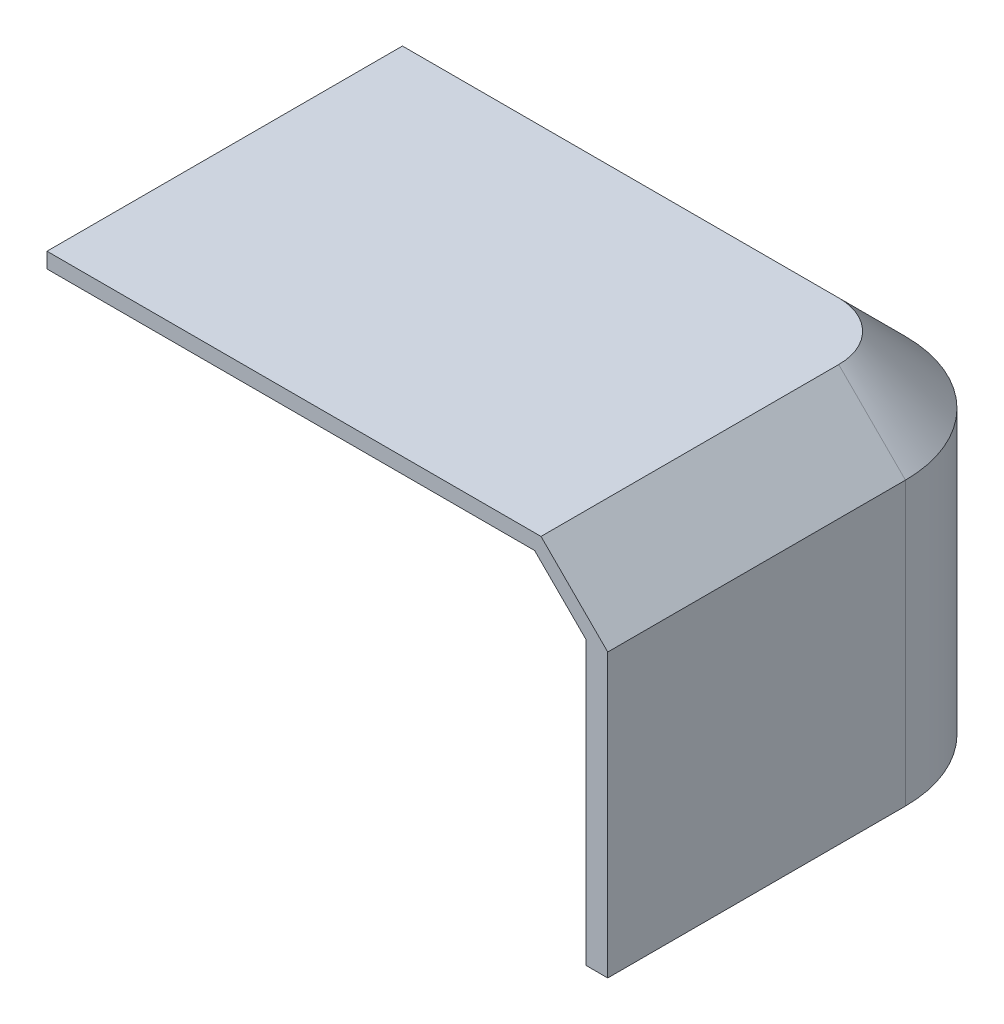
ISO-10303-21;
HEADER;
FILE_DESCRIPTION(('STEP AP214'),'2;1');
FILE_NAME('part.step','',(''),(''),'','','');
FILE_SCHEMA(('AUTOMOTIVE_DESIGN { 1 0 10303 214 1 1 1 1 }'));
ENDSEC;
DATA;
#1=APPLICATION_CONTEXT('core data for automotive mechanical design processes');
#2=APPLICATION_PROTOCOL_DEFINITION('international standard','automotive_design',2000,#1);
#3=PRODUCT_CONTEXT('',#1,'mechanical');
#4=PRODUCT('Part','Part','',(#3));
#5=PRODUCT_RELATED_PRODUCT_CATEGORY('part','',(#4));
#6=PRODUCT_DEFINITION_FORMATION('','',#4);
#7=PRODUCT_DEFINITION_CONTEXT('part definition',#1,'design');
#8=PRODUCT_DEFINITION('design','',#6,#7);
#9=PRODUCT_DEFINITION_SHAPE('','',#8);
#10=(LENGTH_UNIT() NAMED_UNIT(*) SI_UNIT(.MILLI.,.METRE.));
#11=(NAMED_UNIT(*) PLANE_ANGLE_UNIT() SI_UNIT($,.RADIAN.));
#12=(NAMED_UNIT(*) SI_UNIT($,.STERADIAN.) SOLID_ANGLE_UNIT());
#13=UNCERTAINTY_MEASURE_WITH_UNIT(LENGTH_MEASURE(1.E-05),#10,'distance_accuracy_value','');
#14=(GEOMETRIC_REPRESENTATION_CONTEXT(3) GLOBAL_UNCERTAINTY_ASSIGNED_CONTEXT((#13)) GLOBAL_UNIT_ASSIGNED_CONTEXT((#10,
#11,#12)) REPRESENTATION_CONTEXT('',''));
#15=CARTESIAN_POINT('',(0.,0.,0.));
#16=DIRECTION('',(0.,0.,1.));
#17=DIRECTION('',(1.,0.,0.));
#18=AXIS2_PLACEMENT_3D('',#15,#16,#17);
#19=CARTESIAN_POINT('',(0.,-10.,0.));
#20=DIRECTION('',(-1.,0.,0.));
#21=DIRECTION('',(0.,0.,1.));
#22=AXIS2_PLACEMENT_3D('',#19,#20,#21);
#23=PLANE('',#22);
#24=DIRECTION('',(0.,-0.707106781186549,-0.707106781186546));
#25=VECTOR('',#24,1.);
#26=CARTESIAN_POINT('',(0.,29.,-39.0000000000002));
#27=LINE('',#26,#25);
#28=CARTESIAN_POINT('',(0.,0.,-68.));
#29=VERTEX_POINT('',#28);
#30=CARTESIAN_POINT('',(0.,-10.,-78.));
#31=VERTEX_POINT('',#30);
#32=EDGE_CURVE('E149',#29,#31,#27,.T.);
#33=ORIENTED_EDGE('',*,*,#32,.F.);
#34=DIRECTION('',(0.,0.,1.));
#35=VECTOR('',#34,1.);
#36=CARTESIAN_POINT('',(0.,0.,0.));
#37=LINE('',#36,#35);
#38=CARTESIAN_POINT('',(0.,0.,0.));
#39=VERTEX_POINT('',#38);
#40=EDGE_CURVE('E129',#29,#39,#37,.T.);
#41=ORIENTED_EDGE('',*,*,#40,.T.);
#42=DIRECTION('',(0.,1.,0.));
#43=VECTOR('',#42,1.);
#44=CARTESIAN_POINT('',(0.,-10.,0.));
#45=LINE('',#44,#43);
#46=CARTESIAN_POINT('',(0.,3.,0.));
#47=VERTEX_POINT('',#46);
#48=EDGE_CURVE('E156',#39,#47,#45,.T.);
#49=ORIENTED_EDGE('',*,*,#48,.T.);
#50=DIRECTION('',(0.,0.,1.));
#51=VECTOR('',#50,1.);
#52=CARTESIAN_POINT('',(0.,3.,0.));
#53=LINE('',#52,#51);
#54=CARTESIAN_POINT('',(0.,3.,-69.2426406871193));
#55=VERTEX_POINT('',#54);
#56=EDGE_CURVE('E167',#55,#47,#53,.T.);
#57=ORIENTED_EDGE('',*,*,#56,.F.);
#58=DIRECTION('',(0.,-0.707106781186549,-0.707106781186546));
#59=VECTOR('',#58,1.);
#60=CARTESIAN_POINT('',(0.,31.1213203435596,-41.1213203435598));
#61=LINE('',#60,#59);
#62=CARTESIAN_POINT('',(0.,-10.,-82.2426406871193));
#63=VERTEX_POINT('',#62);
#64=EDGE_CURVE('E11',#55,#63,#61,.T.);
#65=ORIENTED_EDGE('',*,*,#64,.T.);
#66=DIRECTION('',(0.,1.,0.));
#67=VECTOR('',#66,1.);
#68=CARTESIAN_POINT('',(0.,-65.,-82.2426406871193));
#69=LINE('',#68,#67);
#70=CARTESIAN_POINT('',(0.,-65.,-82.2426406871193));
#71=VERTEX_POINT('',#70);
#72=EDGE_CURVE('E111',#71,#63,#69,.T.);
#73=ORIENTED_EDGE('',*,*,#72,.F.);
#74=DIRECTION('',(0.,0.,-1.));
#75=VECTOR('',#74,1.);
#76=CARTESIAN_POINT('',(0.,-65.,-78.));
#77=LINE('',#76,#75);
#78=CARTESIAN_POINT('',(0.,-65.,-78.));
#79=VERTEX_POINT('',#78);
#80=EDGE_CURVE('E256',#79,#71,#77,.T.);
#81=ORIENTED_EDGE('',*,*,#80,.F.);
#82=DIRECTION('',(0.,1.,0.));
#83=VECTOR('',#82,1.);
#84=CARTESIAN_POINT('',(0.,-65.,-78.));
#85=LINE('',#84,#83);
#86=EDGE_CURVE('E114',#79,#31,#85,.T.);
#87=ORIENTED_EDGE('',*,*,#86,.T.);
#88=EDGE_LOOP('',(#33,#41,#49,#57,#65,#73,#81,#87));
#89=FACE_BOUND('',#88,.T.);
#90=ADVANCED_FACE('F35',(#89),#23,.T.);
#91=CARTESIAN_POINT('',(0.,-10.,0.));
#92=DIRECTION('',(0.,0.,1.));
#93=DIRECTION('',(1.,0.,0.));
#94=AXIS2_PLACEMENT_3D('',#91,#92,#93);
#95=PLANE('',#94);
#96=DIRECTION('',(-0.707106781186547,0.707106781186548,0.));
#97=VECTOR('',#96,1.);
#98=CARTESIAN_POINT('',(52.5,42.5,0.));
#99=LINE('',#98,#97);
#100=CARTESIAN_POINT('',(105.,-10.,0.));
#101=VERTEX_POINT('',#100);
#102=CARTESIAN_POINT('',(95.,0.,0.));
#103=VERTEX_POINT('',#102);
#104=EDGE_CURVE('E146',#101,#103,#99,.T.);
#105=ORIENTED_EDGE('',*,*,#104,.F.);
#106=DIRECTION('',(0.,1.,0.));
#107=VECTOR('',#106,1.);
#108=CARTESIAN_POINT('',(105.,-65.,0.));
#109=LINE('',#108,#107);
#110=CARTESIAN_POINT('',(105.,-65.,0.));
#111=VERTEX_POINT('',#110);
#112=EDGE_CURVE('E100',#111,#101,#109,.T.);
#113=ORIENTED_EDGE('',*,*,#112,.F.);
#114=DIRECTION('',(-1.,0.,0.));
#115=VECTOR('',#114,1.);
#116=CARTESIAN_POINT('',(109.242640687119,-65.,0.));
#117=LINE('',#116,#115);
#118=CARTESIAN_POINT('',(109.242640687119,-65.,0.));
#119=VERTEX_POINT('',#118);
#120=EDGE_CURVE('E99',#119,#111,#117,.T.);
#121=ORIENTED_EDGE('',*,*,#120,.F.);
#122=DIRECTION('',(0.,1.,0.));
#123=VECTOR('',#122,1.);
#124=CARTESIAN_POINT('',(109.242640687119,-65.,0.));
#125=LINE('',#124,#123);
#126=CARTESIAN_POINT('',(109.242640687119,-10.,0.));
#127=VERTEX_POINT('',#126);
#128=EDGE_CURVE('E89',#119,#127,#125,.T.);
#129=ORIENTED_EDGE('',*,*,#128,.T.);
#130=DIRECTION('',(-0.707106781186547,0.707106781186548,0.));
#131=VECTOR('',#130,1.);
#132=CARTESIAN_POINT('',(54.6213203435597,44.6213203435596,0.));
#133=LINE('',#132,#131);
#134=CARTESIAN_POINT('',(96.2426406871193,3.,0.));
#135=VERTEX_POINT('',#134);
#136=EDGE_CURVE('E39',#127,#135,#133,.T.);
#137=ORIENTED_EDGE('',*,*,#136,.T.);
#138=DIRECTION('',(1.,0.,0.));
#139=VECTOR('',#138,1.);
#140=CARTESIAN_POINT('',(0.,3.,0.));
#141=LINE('',#140,#139);
#142=EDGE_CURVE('E94',#47,#135,#141,.T.);
#143=ORIENTED_EDGE('',*,*,#142,.F.);
#144=ORIENTED_EDGE('',*,*,#48,.F.);
#145=DIRECTION('',(1.,0.,0.));
#146=VECTOR('',#145,1.);
#147=CARTESIAN_POINT('',(0.,0.,0.));
#148=LINE('',#147,#146);
#149=EDGE_CURVE('E125',#39,#103,#148,.T.);
#150=ORIENTED_EDGE('',*,*,#149,.T.);
#151=EDGE_LOOP('',(#105,#113,#121,#129,#137,#143,#144,#150));
#152=FACE_BOUND('',#151,.T.);
#153=ADVANCED_FACE('F96',(#152),#95,.T.);
#154=CARTESIAN_POINT('',(0.,3.,0.));
#155=DIRECTION('',(0.,-1.,0.));
#156=DIRECTION('',(0.,0.,-1.));
#157=AXIS2_PLACEMENT_3D('',#154,#155,#156);
#158=PLANE('',#157);
#159=ORIENTED_EDGE('',*,*,#142,.T.);
#160=DIRECTION('',(0.,0.,-1.));
#161=VECTOR('',#160,1.);
#162=CARTESIAN_POINT('',(96.2426406871193,3.,0.));
#163=LINE('',#162,#161);
#164=CARTESIAN_POINT('',(96.2426406871193,3.,-58.));
#165=VERTEX_POINT('',#164);
#166=EDGE_CURVE('E78',#135,#165,#163,.T.);
#167=ORIENTED_EDGE('',*,*,#166,.T.);
#168=CARTESIAN_POINT('',(85.,3.,-58.));
#169=DIRECTION('',(0.,-1.,0.));
#170=DIRECTION('',(0.,0.,-1.));
#171=AXIS2_PLACEMENT_3D('',#168,#169,#170);
#172=CIRCLE('',#171,11.2426406871193);
#173=CARTESIAN_POINT('',(85.,3.,-69.2426406871193));
#174=VERTEX_POINT('',#173);
#175=EDGE_CURVE('E160',#165,#174,#172,.F.);
#176=ORIENTED_EDGE('',*,*,#175,.T.);
#177=DIRECTION('',(-1.,0.,0.));
#178=VECTOR('',#177,1.);
#179=CARTESIAN_POINT('',(0.,3.,-69.2426406871193));
#180=LINE('',#179,#178);
#181=EDGE_CURVE('E162',#174,#55,#180,.T.);
#182=ORIENTED_EDGE('',*,*,#181,.T.);
#183=ORIENTED_EDGE('',*,*,#56,.T.);
#184=EDGE_LOOP('',(#159,#167,#176,#182,#183));
#185=FACE_BOUND('',#184,.T.);
#186=ADVANCED_FACE('F195',(#185),#158,.F.);
#187=CARTESIAN_POINT('',(0.,2.12132034355964,-70.1213203435597));
#188=DIRECTION('',(0.,0.707106781186546,-0.707106781186549));
#189=DIRECTION('',(1.,0.,0.));
#190=AXIS2_PLACEMENT_3D('',#187,#188,#189);
#191=PLANE('',#190);
#192=ORIENTED_EDGE('',*,*,#64,.F.);
#193=ORIENTED_EDGE('',*,*,#181,.F.);
#194=DIRECTION('',(0.,-0.70710678118655,-0.707106781186545));
#195=VECTOR('',#194,1.);
#196=CARTESIAN_POINT('',(85.,2.12132034355964,-70.1213203435597));
#197=LINE('',#196,#195);
#198=CARTESIAN_POINT('',(85.,-10.,-82.2426406871193));
#199=VERTEX_POINT('',#198);
#200=EDGE_CURVE('E164',#199,#174,#197,.F.);
#201=ORIENTED_EDGE('',*,*,#200,.F.);
#202=DIRECTION('',(-1.,0.,0.));
#203=VECTOR('',#202,1.);
#204=CARTESIAN_POINT('',(0.,-10.,-82.2426406871193));
#205=LINE('',#204,#203);
#206=EDGE_CURVE('E93',#199,#63,#205,.T.);
#207=ORIENTED_EDGE('',*,*,#206,.T.);
#208=EDGE_LOOP('',(#192,#193,#201,#207));
#209=FACE_BOUND('',#208,.T.);
#210=ADVANCED_FACE('F191',(#209),#191,.T.);
#211=CARTESIAN_POINT('',(85.,2.12132034355964,-58.));
#212=DIRECTION('',(0.,-1.,0.));
#213=DIRECTION('',(0.,0.,-1.));
#214=AXIS2_PLACEMENT_3D('',#211,#212,#213);
#215=CONICAL_SURFACE('',#214,12.1213203435597,0.785398163397445);
#216=ORIENTED_EDGE('',*,*,#200,.T.);
#217=ORIENTED_EDGE('',*,*,#175,.F.);
#218=DIRECTION('',(0.707106781186547,-0.707106781186548,0.));
#219=VECTOR('',#218,1.);
#220=CARTESIAN_POINT('',(97.1213203435596,2.12132034355964,-58.));
#221=LINE('',#220,#219);
#222=CARTESIAN_POINT('',(109.242640687119,-10.,-58.));
#223=VERTEX_POINT('',#222);
#224=EDGE_CURVE('E53',#223,#165,#221,.F.);
#225=ORIENTED_EDGE('',*,*,#224,.F.);
#226=CARTESIAN_POINT('',(85.,-10.,-58.));
#227=DIRECTION('',(0.,-1.,0.));
#228=DIRECTION('',(0.,0.,-1.));
#229=AXIS2_PLACEMENT_3D('',#226,#227,#228);
#230=CIRCLE('',#229,24.2426406871193);
#231=EDGE_CURVE('E158',#199,#223,#230,.T.);
#232=ORIENTED_EDGE('',*,*,#231,.F.);
#233=EDGE_LOOP('',(#216,#217,#225,#232));
#234=FACE_BOUND('',#233,.T.);
#235=ADVANCED_FACE('F183',(#234),#215,.T.);
#236=CARTESIAN_POINT('',(97.1213203435596,2.12132034355964,0.));
#237=DIRECTION('',(0.707106781186548,0.707106781186547,0.));
#238=DIRECTION('',(0.,0.,1.));
#239=AXIS2_PLACEMENT_3D('',#236,#237,#238);
#240=PLANE('',#239);
#241=ORIENTED_EDGE('',*,*,#136,.F.);
#242=DIRECTION('',(0.,0.,-1.));
#243=VECTOR('',#242,1.);
#244=CARTESIAN_POINT('',(109.242640687119,-10.,0.));
#245=LINE('',#244,#243);
#246=EDGE_CURVE('E76',#127,#223,#245,.T.);
#247=ORIENTED_EDGE('',*,*,#246,.T.);
#248=ORIENTED_EDGE('',*,*,#224,.T.);
#249=ORIENTED_EDGE('',*,*,#166,.F.);
#250=EDGE_LOOP('',(#241,#247,#248,#249));
#251=FACE_BOUND('',#250,.T.);
#252=ADVANCED_FACE('F37',(#251),#240,.T.);
#253=CARTESIAN_POINT('',(0.,0.,0.));
#254=DIRECTION('',(0.,-1.,0.));
#255=DIRECTION('',(0.,0.,-1.));
#256=AXIS2_PLACEMENT_3D('',#253,#254,#255);
#257=PLANE('',#256);
#258=ORIENTED_EDGE('',*,*,#149,.F.);
#259=ORIENTED_EDGE('',*,*,#40,.F.);
#260=DIRECTION('',(-1.,0.,0.));
#261=VECTOR('',#260,1.);
#262=CARTESIAN_POINT('',(0.,0.,-68.));
#263=LINE('',#262,#261);
#264=CARTESIAN_POINT('',(85.,0.,-68.));
#265=VERTEX_POINT('',#264);
#266=EDGE_CURVE('E137',#265,#29,#263,.T.);
#267=ORIENTED_EDGE('',*,*,#266,.F.);
#268=CARTESIAN_POINT('',(85.,0.,-58.));
#269=DIRECTION('',(0.,-1.,0.));
#270=DIRECTION('',(0.,0.,-1.));
#271=AXIS2_PLACEMENT_3D('',#268,#269,#270);
#272=CIRCLE('',#271,10.);
#273=CARTESIAN_POINT('',(95.,0.,-58.));
#274=VERTEX_POINT('',#273);
#275=EDGE_CURVE('E140',#274,#265,#272,.F.);
#276=ORIENTED_EDGE('',*,*,#275,.F.);
#277=DIRECTION('',(0.,0.,-1.));
#278=VECTOR('',#277,1.);
#279=CARTESIAN_POINT('',(95.,0.,-58.));
#280=LINE('',#279,#278);
#281=EDGE_CURVE('E143',#103,#274,#280,.T.);
#282=ORIENTED_EDGE('',*,*,#281,.F.);
#283=EDGE_LOOP('',(#258,#259,#267,#276,#282));
#284=FACE_BOUND('',#283,.T.);
#285=ADVANCED_FACE('F232',(#284),#257,.T.);
#286=CARTESIAN_POINT('',(0.,0.,-68.));
#287=DIRECTION('',(0.,0.707106781186546,-0.707106781186549));
#288=DIRECTION('',(1.,0.,0.));
#289=AXIS2_PLACEMENT_3D('',#286,#287,#288);
#290=PLANE('',#289);
#291=ORIENTED_EDGE('',*,*,#32,.T.);
#292=DIRECTION('',(-1.,0.,0.));
#293=VECTOR('',#292,1.);
#294=CARTESIAN_POINT('',(0.,-10.,-78.));
#295=LINE('',#294,#293);
#296=CARTESIAN_POINT('',(85.,-10.,-78.));
#297=VERTEX_POINT('',#296);
#298=EDGE_CURVE('E124',#297,#31,#295,.T.);
#299=ORIENTED_EDGE('',*,*,#298,.F.);
#300=DIRECTION('',(0.,0.707106781186549,0.707106781186546));
#301=VECTOR('',#300,1.);
#302=CARTESIAN_POINT('',(85.,-10.,-78.));
#303=LINE('',#302,#301);
#304=EDGE_CURVE('E132',#297,#265,#303,.T.);
#305=ORIENTED_EDGE('',*,*,#304,.T.);
#306=ORIENTED_EDGE('',*,*,#266,.T.);
#307=EDGE_LOOP('',(#291,#299,#305,#306));
#308=FACE_BOUND('',#307,.T.);
#309=ADVANCED_FACE('F283',(#308),#290,.F.);
#310=CARTESIAN_POINT('',(85.,0.,-58.));
#311=DIRECTION('',(0.,-1.,0.));
#312=DIRECTION('',(0.,0.,-1.));
#313=AXIS2_PLACEMENT_3D('',#310,#311,#312);
#314=CONICAL_SURFACE('',#313,10.,0.785398163397445);
#315=ORIENTED_EDGE('',*,*,#304,.F.);
#316=CARTESIAN_POINT('',(85.,-10.,-58.));
#317=DIRECTION('',(0.,-1.,0.));
#318=DIRECTION('',(0.,0.,-1.));
#319=AXIS2_PLACEMENT_3D('',#316,#317,#318);
#320=CIRCLE('',#319,20.);
#321=CARTESIAN_POINT('',(105.,-10.,-58.));
#322=VERTEX_POINT('',#321);
#323=EDGE_CURVE('E128',#297,#322,#320,.T.);
#324=ORIENTED_EDGE('',*,*,#323,.T.);
#325=DIRECTION('',(-0.707106781186546,0.707106781186549,0.));
#326=VECTOR('',#325,1.);
#327=CARTESIAN_POINT('',(105.,-10.,-58.));
#328=LINE('',#327,#326);
#329=EDGE_CURVE('E120',#322,#274,#328,.T.);
#330=ORIENTED_EDGE('',*,*,#329,.T.);
#331=ORIENTED_EDGE('',*,*,#275,.T.);
#332=EDGE_LOOP('',(#315,#324,#330,#331));
#333=FACE_BOUND('',#332,.T.);
#334=ADVANCED_FACE('F227',(#333),#314,.F.);
#335=CARTESIAN_POINT('',(95.,0.,0.));
#336=DIRECTION('',(0.707106781186548,0.707106781186547,0.));
#337=DIRECTION('',(0.,0.,1.));
#338=AXIS2_PLACEMENT_3D('',#335,#336,#337);
#339=PLANE('',#338);
#340=ORIENTED_EDGE('',*,*,#104,.T.);
#341=ORIENTED_EDGE('',*,*,#281,.T.);
#342=ORIENTED_EDGE('',*,*,#329,.F.);
#343=DIRECTION('',(0.,0.,-1.));
#344=VECTOR('',#343,1.);
#345=CARTESIAN_POINT('',(105.,-10.,0.));
#346=LINE('',#345,#344);
#347=EDGE_CURVE('E121',#101,#322,#346,.T.);
#348=ORIENTED_EDGE('',*,*,#347,.F.);
#349=EDGE_LOOP('',(#340,#341,#342,#348));
#350=FACE_BOUND('',#349,.T.);
#351=ADVANCED_FACE('F233',(#350),#339,.F.);
#352=CARTESIAN_POINT('',(85.,-65.,-58.));
#353=DIRECTION('',(0.,1.,0.));
#354=DIRECTION('',(0.,0.,1.));
#355=AXIS2_PLACEMENT_3D('',#352,#353,#354);
#356=CYLINDRICAL_SURFACE('',#355,20.);
#357=ORIENTED_EDGE('',*,*,#323,.F.);
#358=DIRECTION('',(0.,1.,0.));
#359=VECTOR('',#358,1.);
#360=CARTESIAN_POINT('',(85.,-65.,-78.));
#361=LINE('',#360,#359);
#362=CARTESIAN_POINT('',(85.,-65.,-78.));
#363=VERTEX_POINT('',#362);
#364=EDGE_CURVE('E117',#363,#297,#361,.T.);
#365=ORIENTED_EDGE('',*,*,#364,.F.);
#366=CARTESIAN_POINT('',(85.,-65.,-58.));
#367=DIRECTION('',(0.,1.,0.));
#368=DIRECTION('',(0.,0.,-1.));
#369=AXIS2_PLACEMENT_3D('',#366,#367,#368);
#370=CIRCLE('',#369,20.);
#371=CARTESIAN_POINT('',(105.,-65.,-58.));
#372=VERTEX_POINT('',#371);
#373=EDGE_CURVE('E262',#372,#363,#370,.T.);
#374=ORIENTED_EDGE('',*,*,#373,.F.);
#375=DIRECTION('',(0.,1.,0.));
#376=VECTOR('',#375,1.);
#377=CARTESIAN_POINT('',(105.,-65.,-58.));
#378=LINE('',#377,#376);
#379=EDGE_CURVE('E105',#372,#322,#378,.T.);
#380=ORIENTED_EDGE('',*,*,#379,.T.);
#381=EDGE_LOOP('',(#357,#365,#374,#380));
#382=FACE_BOUND('',#381,.T.);
#383=ADVANCED_FACE('F271',(#382),#356,.F.);
#384=CARTESIAN_POINT('',(85.,-65.,-78.));
#385=DIRECTION('',(0.,0.,-1.));
#386=DIRECTION('',(-1.,0.,0.));
#387=AXIS2_PLACEMENT_3D('',#384,#385,#386);
#388=PLANE('',#387);
#389=ORIENTED_EDGE('',*,*,#298,.T.);
#390=ORIENTED_EDGE('',*,*,#86,.F.);
#391=DIRECTION('',(-1.,0.,0.));
#392=VECTOR('',#391,1.);
#393=CARTESIAN_POINT('',(85.,-65.,-78.));
#394=LINE('',#393,#392);
#395=EDGE_CURVE('E259',#363,#79,#394,.T.);
#396=ORIENTED_EDGE('',*,*,#395,.F.);
#397=ORIENTED_EDGE('',*,*,#364,.T.);
#398=EDGE_LOOP('',(#389,#390,#396,#397));
#399=FACE_BOUND('',#398,.T.);
#400=ADVANCED_FACE('F273',(#399),#388,.F.);
#401=CARTESIAN_POINT('',(0.,-65.,-82.2426406871193));
#402=DIRECTION('',(0.,0.,1.));
#403=DIRECTION('',(1.,0.,0.));
#404=AXIS2_PLACEMENT_3D('',#401,#402,#403);
#405=PLANE('',#404);
#406=ORIENTED_EDGE('',*,*,#206,.F.);
#407=DIRECTION('',(0.,1.,0.));
#408=VECTOR('',#407,1.);
#409=CARTESIAN_POINT('',(85.,-65.,-82.2426406871193));
#410=LINE('',#409,#408);
#411=CARTESIAN_POINT('',(85.,-65.,-82.2426406871193));
#412=VERTEX_POINT('',#411);
#413=EDGE_CURVE('E102',#412,#199,#410,.T.);
#414=ORIENTED_EDGE('',*,*,#413,.F.);
#415=DIRECTION('',(1.,0.,0.));
#416=VECTOR('',#415,1.);
#417=CARTESIAN_POINT('',(0.,-65.,-82.2426406871193));
#418=LINE('',#417,#416);
#419=EDGE_CURVE('E253',#71,#412,#418,.T.);
#420=ORIENTED_EDGE('',*,*,#419,.F.);
#421=ORIENTED_EDGE('',*,*,#72,.T.);
#422=EDGE_LOOP('',(#406,#414,#420,#421));
#423=FACE_BOUND('',#422,.T.);
#424=ADVANCED_FACE('F185',(#423),#405,.F.);
#425=CARTESIAN_POINT('',(85.,-65.,-58.));
#426=DIRECTION('',(0.,1.,0.));
#427=DIRECTION('',(0.,0.,1.));
#428=AXIS2_PLACEMENT_3D('',#425,#426,#427);
#429=CYLINDRICAL_SURFACE('',#428,24.2426406871193);
#430=ORIENTED_EDGE('',*,*,#231,.T.);
#431=DIRECTION('',(0.,1.,0.));
#432=VECTOR('',#431,1.);
#433=CARTESIAN_POINT('',(109.242640687119,-65.,-58.));
#434=LINE('',#433,#432);
#435=CARTESIAN_POINT('',(109.242640687119,-65.,-58.));
#436=VERTEX_POINT('',#435);
#437=EDGE_CURVE('E92',#436,#223,#434,.T.);
#438=ORIENTED_EDGE('',*,*,#437,.F.);
#439=CARTESIAN_POINT('',(85.,-65.,-58.));
#440=DIRECTION('',(0.,-1.,0.));
#441=DIRECTION('',(0.,0.,-1.));
#442=AXIS2_PLACEMENT_3D('',#439,#440,#441);
#443=CIRCLE('',#442,24.2426406871193);
#444=EDGE_CURVE('E250',#412,#436,#443,.T.);
#445=ORIENTED_EDGE('',*,*,#444,.F.);
#446=ORIENTED_EDGE('',*,*,#413,.T.);
#447=EDGE_LOOP('',(#430,#438,#445,#446));
#448=FACE_BOUND('',#447,.T.);
#449=ADVANCED_FACE('F177',(#448),#429,.T.);
#450=CARTESIAN_POINT('',(109.242640687119,-65.,-58.));
#451=DIRECTION('',(-1.,0.,0.));
#452=DIRECTION('',(0.,0.,1.));
#453=AXIS2_PLACEMENT_3D('',#450,#451,#452);
#454=PLANE('',#453);
#455=ORIENTED_EDGE('',*,*,#246,.F.);
#456=ORIENTED_EDGE('',*,*,#128,.F.);
#457=DIRECTION('',(0.,0.,1.));
#458=VECTOR('',#457,1.);
#459=CARTESIAN_POINT('',(109.242640687119,-65.,-58.));
#460=LINE('',#459,#458);
#461=EDGE_CURVE('E245',#436,#119,#460,.T.);
#462=ORIENTED_EDGE('',*,*,#461,.F.);
#463=ORIENTED_EDGE('',*,*,#437,.T.);
#464=EDGE_LOOP('',(#455,#456,#462,#463));
#465=FACE_BOUND('',#464,.T.);
#466=ADVANCED_FACE('F86',(#465),#454,.F.);
#467=CARTESIAN_POINT('',(105.,-65.,0.));
#468=DIRECTION('',(1.,0.,0.));
#469=DIRECTION('',(0.,0.,-1.));
#470=AXIS2_PLACEMENT_3D('',#467,#468,#469);
#471=PLANE('',#470);
#472=ORIENTED_EDGE('',*,*,#347,.T.);
#473=ORIENTED_EDGE('',*,*,#379,.F.);
#474=DIRECTION('',(0.,0.,-1.));
#475=VECTOR('',#474,1.);
#476=CARTESIAN_POINT('',(105.,-65.,0.));
#477=LINE('',#476,#475);
#478=EDGE_CURVE('E239',#111,#372,#477,.T.);
#479=ORIENTED_EDGE('',*,*,#478,.F.);
#480=ORIENTED_EDGE('',*,*,#112,.T.);
#481=EDGE_LOOP('',(#472,#473,#479,#480));
#482=FACE_BOUND('',#481,.T.);
#483=ADVANCED_FACE('F236',(#482),#471,.F.);
#484=CARTESIAN_POINT('',(85.,-65.,-58.));
#485=DIRECTION('',(0.,-1.,0.));
#486=DIRECTION('',(0.,0.,-1.));
#487=AXIS2_PLACEMENT_3D('',#484,#485,#486);
#488=PLANE('',#487);
#489=ORIENTED_EDGE('',*,*,#373,.T.);
#490=ORIENTED_EDGE('',*,*,#395,.T.);
#491=ORIENTED_EDGE('',*,*,#80,.T.);
#492=ORIENTED_EDGE('',*,*,#419,.T.);
#493=ORIENTED_EDGE('',*,*,#444,.T.);
#494=ORIENTED_EDGE('',*,*,#461,.T.);
#495=ORIENTED_EDGE('',*,*,#120,.T.);
#496=ORIENTED_EDGE('',*,*,#478,.T.);
#497=EDGE_LOOP('',(#489,#490,#491,#492,#493,#494,#495,#496));
#498=FACE_BOUND('',#497,.T.);
#499=ADVANCED_FACE('F265',(#498),#488,.T.);
#500=CLOSED_SHELL('',(#90,#153,#186,#210,#235,#252,#285,#309,#334,#351,#383,#400,#424,#449,#466,
#483,#499));
#501=MANIFOLD_SOLID_BREP('B2',#500);
#502=ADVANCED_BREP_SHAPE_REPRESENTATION('',(#18,#501),#14);
#503=SHAPE_DEFINITION_REPRESENTATION(#9,#502);
ENDSEC;
END-ISO-10303-21;
